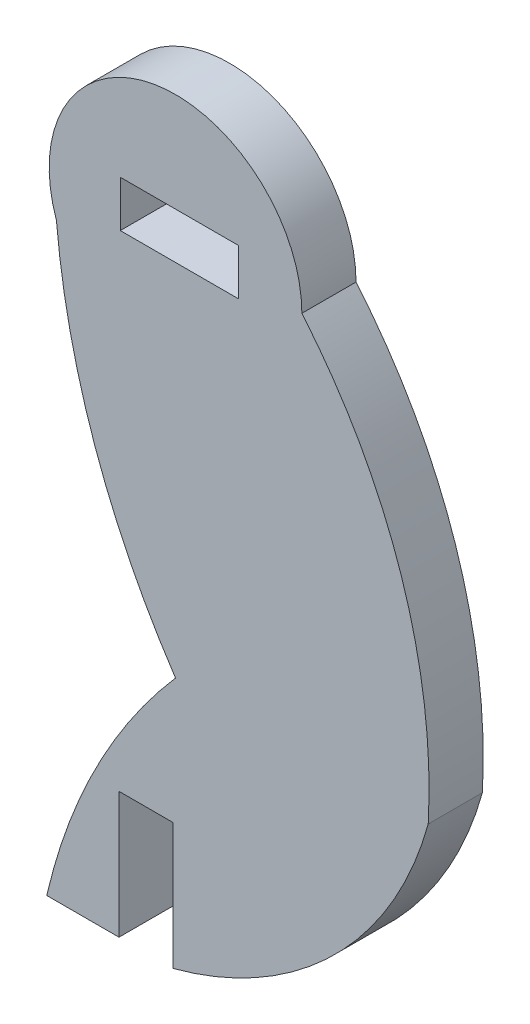
ISO-10303-21;
HEADER;
FILE_DESCRIPTION(('STEP AP214'),'2;1');
FILE_NAME('part.step','',(''),(''),'','','');
FILE_SCHEMA(('AUTOMOTIVE_DESIGN { 1 0 10303 214 1 1 1 1 }'));
ENDSEC;
DATA;
#1=APPLICATION_CONTEXT('core data for automotive mechanical design processes');
#2=APPLICATION_PROTOCOL_DEFINITION('international standard','automotive_design',2000,#1);
#3=PRODUCT_CONTEXT('',#1,'mechanical');
#4=PRODUCT('Part','Part','',(#3));
#5=PRODUCT_RELATED_PRODUCT_CATEGORY('part','',(#4));
#6=PRODUCT_DEFINITION_FORMATION('','',#4);
#7=PRODUCT_DEFINITION_CONTEXT('part definition',#1,'design');
#8=PRODUCT_DEFINITION('design','',#6,#7);
#9=PRODUCT_DEFINITION_SHAPE('','',#8);
#10=(LENGTH_UNIT() NAMED_UNIT(*) SI_UNIT(.MILLI.,.METRE.));
#11=(NAMED_UNIT(*) PLANE_ANGLE_UNIT() SI_UNIT($,.RADIAN.));
#12=(NAMED_UNIT(*) SI_UNIT($,.STERADIAN.) SOLID_ANGLE_UNIT());
#13=UNCERTAINTY_MEASURE_WITH_UNIT(LENGTH_MEASURE(1.E-05),#10,'distance_accuracy_value','');
#14=(GEOMETRIC_REPRESENTATION_CONTEXT(3) GLOBAL_UNCERTAINTY_ASSIGNED_CONTEXT((#13)) GLOBAL_UNIT_ASSIGNED_CONTEXT((#10,
#11,#12)) REPRESENTATION_CONTEXT('',''));
#15=CARTESIAN_POINT('',(0.,0.,0.));
#16=DIRECTION('',(0.,0.,1.));
#17=DIRECTION('',(1.,0.,0.));
#18=AXIS2_PLACEMENT_3D('',#15,#16,#17);
#19=CARTESIAN_POINT('',(33.239340376163,1.25188197338785,3.));
#20=DIRECTION('',(0.,0.,-1.));
#21=DIRECTION('',(-1.,0.,0.));
#22=AXIS2_PLACEMENT_3D('',#19,#20,#21);
#23=CYLINDRICAL_SURFACE('',#22,40.);
#24=CARTESIAN_POINT('',(33.239340376163,1.25188197338785,0.));
#25=DIRECTION('',(0.,0.,1.));
#26=DIRECTION('',(1.,0.,0.));
#27=AXIS2_PLACEMENT_3D('',#24,#25,#26);
#28=CIRCLE('',#27,40.);
#29=CARTESIAN_POINT('',(0.,-21.,0.));
#30=VERTEX_POINT('',#29);
#31=CARTESIAN_POINT('',(-6.59966359422625,-2.33333247589036,0.));
#32=VERTEX_POINT('',#31);
#33=EDGE_CURVE('E211',#30,#32,#28,.F.);
#34=ORIENTED_EDGE('',*,*,#33,.F.);
#35=DIRECTION('',(0.,0.,-1.));
#36=VECTOR('',#35,1.);
#37=CARTESIAN_POINT('',(0.,-21.,3.));
#38=LINE('',#37,#36);
#39=CARTESIAN_POINT('',(0.,-21.,3.));
#40=VERTEX_POINT('',#39);
#41=EDGE_CURVE('E11',#40,#30,#38,.T.);
#42=ORIENTED_EDGE('',*,*,#41,.F.);
#43=CARTESIAN_POINT('',(33.239340376163,1.25188197338785,3.));
#44=DIRECTION('',(0.,0.,1.));
#45=DIRECTION('',(1.,0.,0.));
#46=AXIS2_PLACEMENT_3D('',#43,#44,#45);
#47=CIRCLE('',#46,40.);
#48=CARTESIAN_POINT('',(-6.59966359422625,-2.33333247589036,3.));
#49=VERTEX_POINT('',#48);
#50=EDGE_CURVE('E237',#40,#49,#47,.F.);
#51=ORIENTED_EDGE('',*,*,#50,.T.);
#52=DIRECTION('',(0.,0.,-1.));
#53=VECTOR('',#52,1.);
#54=CARTESIAN_POINT('',(-6.59966359422625,-2.33333247589036,3.));
#55=LINE('',#54,#53);
#56=EDGE_CURVE('E110',#49,#32,#55,.T.);
#57=ORIENTED_EDGE('',*,*,#56,.T.);
#58=EDGE_LOOP('',(#34,#42,#51,#57));
#59=FACE_BOUND('',#58,.T.);
#60=ADVANCED_FACE('F39',(#59),#23,.T.);
#61=CARTESIAN_POINT('',(24.3358214857125,-42.2134191295325,3.));
#62=DIRECTION('',(0.,0.,-1.));
#63=DIRECTION('',(-1.,0.,0.));
#64=AXIS2_PLACEMENT_3D('',#61,#62,#63);
#65=CYLINDRICAL_SURFACE('',#64,32.2837630791344);
#66=CARTESIAN_POINT('',(24.3358214857125,-42.2134191295325,0.));
#67=DIRECTION('',(0.,0.,1.));
#68=DIRECTION('',(1.,0.,0.));
#69=AXIS2_PLACEMENT_3D('',#66,#67,#68);
#70=CIRCLE('',#69,32.2837630791344);
#71=CARTESIAN_POINT('',(-7.13174821725912,-35.,0.));
#72=VERTEX_POINT('',#71);
#73=EDGE_CURVE('E208',#72,#30,#70,.F.);
#74=ORIENTED_EDGE('',*,*,#73,.F.);
#75=DIRECTION('',(0.,0.,-1.));
#76=VECTOR('',#75,1.);
#77=CARTESIAN_POINT('',(-7.13174821725912,-35.,3.));
#78=LINE('',#77,#76);
#79=CARTESIAN_POINT('',(-7.13174821725912,-35.,3.));
#80=VERTEX_POINT('',#79);
#81=EDGE_CURVE('E47',#80,#72,#78,.T.);
#82=ORIENTED_EDGE('',*,*,#81,.F.);
#83=CARTESIAN_POINT('',(24.3358214857125,-42.2134191295325,3.));
#84=DIRECTION('',(0.,0.,1.));
#85=DIRECTION('',(1.,0.,0.));
#86=AXIS2_PLACEMENT_3D('',#83,#84,#85);
#87=CIRCLE('',#86,32.2837630791344);
#88=EDGE_CURVE('E235',#80,#40,#87,.F.);
#89=ORIENTED_EDGE('',*,*,#88,.T.);
#90=ORIENTED_EDGE('',*,*,#41,.T.);
#91=EDGE_LOOP('',(#74,#82,#89,#90));
#92=FACE_BOUND('',#91,.T.);
#93=ADVANCED_FACE('F266',(#92),#65,.T.);
#94=CARTESIAN_POINT('',(0.,-35.,3.));
#95=DIRECTION('',(0.,-1.,0.));
#96=DIRECTION('',(0.,0.,-1.));
#97=AXIS2_PLACEMENT_3D('',#94,#95,#96);
#98=PLANE('',#97);
#99=DIRECTION('',(-1.,0.,0.));
#100=VECTOR('',#99,1.);
#101=CARTESIAN_POINT('',(0.,-35.,0.));
#102=LINE('',#101,#100);
#103=CARTESIAN_POINT('',(-3.1317482172591,-35.,0.));
#104=VERTEX_POINT('',#103);
#105=EDGE_CURVE('E202',#104,#72,#102,.T.);
#106=ORIENTED_EDGE('',*,*,#105,.F.);
#107=DIRECTION('',(0.,0.,-1.));
#108=VECTOR('',#107,1.);
#109=CARTESIAN_POINT('',(-3.1317482172591,-35.,3.));
#110=LINE('',#109,#108);
#111=CARTESIAN_POINT('',(-3.1317482172591,-35.,3.));
#112=VERTEX_POINT('',#111);
#113=EDGE_CURVE('E176',#112,#104,#110,.T.);
#114=ORIENTED_EDGE('',*,*,#113,.F.);
#115=DIRECTION('',(-1.,0.,0.));
#116=VECTOR('',#115,1.);
#117=CARTESIAN_POINT('',(0.,-35.,3.));
#118=LINE('',#117,#116);
#119=EDGE_CURVE('E228',#112,#80,#118,.T.);
#120=ORIENTED_EDGE('',*,*,#119,.T.);
#121=ORIENTED_EDGE('',*,*,#81,.T.);
#122=EDGE_LOOP('',(#106,#114,#120,#121));
#123=FACE_BOUND('',#122,.T.);
#124=ADVANCED_FACE('F271',(#123),#98,.T.);
#125=CARTESIAN_POINT('',(-3.1317482172591,0.,3.));
#126=DIRECTION('',(-1.,0.,0.));
#127=DIRECTION('',(0.,-1.,0.));
#128=AXIS2_PLACEMENT_3D('',#125,#126,#127);
#129=PLANE('',#128);
#130=DIRECTION('',(0.,1.,0.));
#131=VECTOR('',#130,1.);
#132=CARTESIAN_POINT('',(-3.1317482172591,0.,0.));
#133=LINE('',#132,#131);
#134=CARTESIAN_POINT('',(-3.1317482172591,-28.,0.));
#135=VERTEX_POINT('',#134);
#136=EDGE_CURVE('E205',#104,#135,#133,.T.);
#137=ORIENTED_EDGE('',*,*,#136,.T.);
#138=DIRECTION('',(0.,0.,-1.));
#139=VECTOR('',#138,1.);
#140=CARTESIAN_POINT('',(-3.1317482172591,-28.,3.));
#141=LINE('',#140,#139);
#142=CARTESIAN_POINT('',(-3.1317482172591,-28.,3.));
#143=VERTEX_POINT('',#142);
#144=EDGE_CURVE('E173',#143,#135,#141,.T.);
#145=ORIENTED_EDGE('',*,*,#144,.F.);
#146=DIRECTION('',(0.,1.,0.));
#147=VECTOR('',#146,1.);
#148=CARTESIAN_POINT('',(-3.1317482172591,0.,3.));
#149=LINE('',#148,#147);
#150=EDGE_CURVE('E229',#112,#143,#149,.T.);
#151=ORIENTED_EDGE('',*,*,#150,.F.);
#152=ORIENTED_EDGE('',*,*,#113,.T.);
#153=EDGE_LOOP('',(#137,#145,#151,#152));
#154=FACE_BOUND('',#153,.T.);
#155=ADVANCED_FACE('F280',(#154),#129,.F.);
#156=CARTESIAN_POINT('',(0.,-28.,3.));
#157=DIRECTION('',(0.,-1.,0.));
#158=DIRECTION('',(1.,0.,0.));
#159=AXIS2_PLACEMENT_3D('',#156,#157,#158);
#160=PLANE('',#159);
#161=DIRECTION('',(-1.,0.,0.));
#162=VECTOR('',#161,1.);
#163=CARTESIAN_POINT('',(0.,-28.,0.));
#164=LINE('',#163,#162);
#165=CARTESIAN_POINT('',(-0.131748217259136,-28.,0.));
#166=VERTEX_POINT('',#165);
#167=EDGE_CURVE('E200',#166,#135,#164,.T.);
#168=ORIENTED_EDGE('',*,*,#167,.F.);
#169=DIRECTION('',(0.,0.,-1.));
#170=VECTOR('',#169,1.);
#171=CARTESIAN_POINT('',(-0.131748217259136,-28.,3.));
#172=LINE('',#171,#170);
#173=CARTESIAN_POINT('',(-0.131748217259136,-28.,3.));
#174=VERTEX_POINT('',#173);
#175=EDGE_CURVE('E166',#174,#166,#172,.T.);
#176=ORIENTED_EDGE('',*,*,#175,.F.);
#177=DIRECTION('',(-1.,0.,0.));
#178=VECTOR('',#177,1.);
#179=CARTESIAN_POINT('',(0.,-28.,3.));
#180=LINE('',#179,#178);
#181=EDGE_CURVE('E223',#174,#143,#180,.T.);
#182=ORIENTED_EDGE('',*,*,#181,.T.);
#183=ORIENTED_EDGE('',*,*,#144,.T.);
#184=EDGE_LOOP('',(#168,#176,#182,#183));
#185=FACE_BOUND('',#184,.T.);
#186=ADVANCED_FACE('F282',(#185),#160,.T.);
#187=CARTESIAN_POINT('',(-0.131748217259216,0.,3.));
#188=DIRECTION('',(-1.,0.,0.));
#189=DIRECTION('',(0.,-1.,0.));
#190=AXIS2_PLACEMENT_3D('',#187,#188,#189);
#191=PLANE('',#190);
#192=DIRECTION('',(0.,1.,0.));
#193=VECTOR('',#192,1.);
#194=CARTESIAN_POINT('',(-0.131748217259216,0.,0.));
#195=LINE('',#194,#193);
#196=CARTESIAN_POINT('',(-0.131748217259115,-35.,0.));
#197=VERTEX_POINT('',#196);
#198=EDGE_CURVE('E198',#197,#166,#195,.T.);
#199=ORIENTED_EDGE('',*,*,#198,.F.);
#200=DIRECTION('',(0.,0.,-1.));
#201=VECTOR('',#200,1.);
#202=CARTESIAN_POINT('',(-0.131748217259115,-35.,3.));
#203=LINE('',#202,#201);
#204=CARTESIAN_POINT('',(-0.131748217259115,-35.,3.));
#205=VERTEX_POINT('',#204);
#206=EDGE_CURVE('E170',#205,#197,#203,.T.);
#207=ORIENTED_EDGE('',*,*,#206,.F.);
#208=DIRECTION('',(0.,1.,0.));
#209=VECTOR('',#208,1.);
#210=CARTESIAN_POINT('',(-0.131748217259216,0.,3.));
#211=LINE('',#210,#209);
#212=EDGE_CURVE('E161',#205,#174,#211,.T.);
#213=ORIENTED_EDGE('',*,*,#212,.T.);
#214=ORIENTED_EDGE('',*,*,#175,.T.);
#215=EDGE_LOOP('',(#199,#207,#213,#214));
#216=FACE_BOUND('',#215,.T.);
#217=ADVANCED_FACE('F283',(#216),#191,.T.);
#218=CARTESIAN_POINT('',(-5.27762001725334,-15.6733343947275,3.));
#219=DIRECTION('',(0.,0.,-1.));
#220=DIRECTION('',(-1.,0.,0.));
#221=AXIS2_PLACEMENT_3D('',#218,#219,#220);
#222=CYLINDRICAL_SURFACE('',#221,20.);
#223=CARTESIAN_POINT('',(-5.27762001725334,-15.6733343947275,0.));
#224=DIRECTION('',(0.,0.,1.));
#225=DIRECTION('',(1.,0.,0.));
#226=AXIS2_PLACEMENT_3D('',#223,#224,#225);
#227=CIRCLE('',#226,20.);
#228=CARTESIAN_POINT('',(14.,-21.,0.));
#229=VERTEX_POINT('',#228);
#230=EDGE_CURVE('E167',#197,#229,#227,.T.);
#231=ORIENTED_EDGE('',*,*,#230,.T.);
#232=DIRECTION('',(0.,0.,-1.));
#233=VECTOR('',#232,1.);
#234=CARTESIAN_POINT('',(14.,-21.,3.));
#235=LINE('',#234,#233);
#236=CARTESIAN_POINT('',(14.,-21.,3.));
#237=VERTEX_POINT('',#236);
#238=EDGE_CURVE('E151',#237,#229,#235,.T.);
#239=ORIENTED_EDGE('',*,*,#238,.F.);
#240=CARTESIAN_POINT('',(-5.27762001725334,-15.6733343947275,3.));
#241=DIRECTION('',(0.,0.,1.));
#242=DIRECTION('',(1.,0.,0.));
#243=AXIS2_PLACEMENT_3D('',#240,#241,#242);
#244=CIRCLE('',#243,20.);
#245=EDGE_CURVE('E152',#205,#237,#244,.T.);
#246=ORIENTED_EDGE('',*,*,#245,.F.);
#247=ORIENTED_EDGE('',*,*,#206,.T.);
#248=EDGE_LOOP('',(#231,#239,#246,#247));
#249=FACE_BOUND('',#248,.T.);
#250=ADVANCED_FACE('F163',(#249),#222,.T.);
#251=CARTESIAN_POINT('',(-15.9527881328226,-19.3175960442742,3.));
#252=DIRECTION('',(0.,0.,-1.));
#253=DIRECTION('',(-1.,0.,0.));
#254=AXIS2_PLACEMENT_3D('',#251,#252,#253);
#255=CYLINDRICAL_SURFACE('',#254,30.);
#256=CARTESIAN_POINT('',(-15.9527881328226,-19.3175960442742,0.));
#257=DIRECTION('',(0.,0.,1.));
#258=DIRECTION('',(1.,0.,0.));
#259=AXIS2_PLACEMENT_3D('',#256,#257,#258);
#260=CIRCLE('',#259,30.);
#261=CARTESIAN_POINT('',(7.,0.,0.));
#262=VERTEX_POINT('',#261);
#263=EDGE_CURVE('E195',#229,#262,#260,.T.);
#264=ORIENTED_EDGE('',*,*,#263,.T.);
#265=DIRECTION('',(0.,0.,-1.));
#266=VECTOR('',#265,1.);
#267=CARTESIAN_POINT('',(7.,0.,3.));
#268=LINE('',#267,#266);
#269=CARTESIAN_POINT('',(7.,0.,3.));
#270=VERTEX_POINT('',#269);
#271=EDGE_CURVE('E153',#270,#262,#268,.T.);
#272=ORIENTED_EDGE('',*,*,#271,.F.);
#273=CARTESIAN_POINT('',(-15.9527881328226,-19.3175960442742,3.));
#274=DIRECTION('',(0.,0.,1.));
#275=DIRECTION('',(1.,0.,0.));
#276=AXIS2_PLACEMENT_3D('',#273,#274,#275);
#277=CIRCLE('',#276,30.);
#278=EDGE_CURVE('E148',#237,#270,#277,.T.);
#279=ORIENTED_EDGE('',*,*,#278,.F.);
#280=ORIENTED_EDGE('',*,*,#238,.T.);
#281=EDGE_LOOP('',(#264,#272,#279,#280));
#282=FACE_BOUND('',#281,.T.);
#283=ADVANCED_FACE('F149',(#282),#255,.T.);
#284=CARTESIAN_POINT('',(0.,1.5,3.));
#285=DIRECTION('',(0.,1.,0.));
#286=DIRECTION('',(0.,0.,1.));
#287=AXIS2_PLACEMENT_3D('',#284,#285,#286);
#288=PLANE('',#287);
#289=DIRECTION('',(1.,0.,0.));
#290=VECTOR('',#289,1.);
#291=CARTESIAN_POINT('',(0.,1.5,0.));
#292=LINE('',#291,#290);
#293=CARTESIAN_POINT('',(-3.06,1.5,0.));
#294=VERTEX_POINT('',#293);
#295=CARTESIAN_POINT('',(3.5,1.5,0.));
#296=VERTEX_POINT('',#295);
#297=EDGE_CURVE('E222',#294,#296,#292,.T.);
#298=ORIENTED_EDGE('',*,*,#297,.T.);
#299=DIRECTION('',(0.,0.,-1.));
#300=VECTOR('',#299,1.);
#301=CARTESIAN_POINT('',(3.5,1.5,3.));
#302=LINE('',#301,#300);
#303=CARTESIAN_POINT('',(3.5,1.5,3.));
#304=VERTEX_POINT('',#303);
#305=EDGE_CURVE('E43',#304,#296,#302,.T.);
#306=ORIENTED_EDGE('',*,*,#305,.F.);
#307=DIRECTION('',(1.,0.,0.));
#308=VECTOR('',#307,1.);
#309=CARTESIAN_POINT('',(0.,1.5,3.));
#310=LINE('',#309,#308);
#311=CARTESIAN_POINT('',(-3.06,1.5,3.));
#312=VERTEX_POINT('',#311);
#313=EDGE_CURVE('E191',#312,#304,#310,.T.);
#314=ORIENTED_EDGE('',*,*,#313,.F.);
#315=DIRECTION('',(0.,0.,-1.));
#316=VECTOR('',#315,1.);
#317=CARTESIAN_POINT('',(-3.06,1.5,3.));
#318=LINE('',#317,#316);
#319=EDGE_CURVE('E177',#312,#294,#318,.T.);
#320=ORIENTED_EDGE('',*,*,#319,.T.);
#321=EDGE_LOOP('',(#298,#306,#314,#320));
#322=FACE_BOUND('',#321,.T.);
#323=ADVANCED_FACE('F41',(#322),#288,.F.);
#324=CARTESIAN_POINT('',(3.5,0.,3.));
#325=DIRECTION('',(1.,0.,0.));
#326=DIRECTION('',(0.,1.,0.));
#327=AXIS2_PLACEMENT_3D('',#324,#325,#326);
#328=PLANE('',#327);
#329=DIRECTION('',(0.,-1.,0.));
#330=VECTOR('',#329,1.);
#331=CARTESIAN_POINT('',(3.5,0.,0.));
#332=LINE('',#331,#330);
#333=CARTESIAN_POINT('',(3.5,-1.06,0.));
#334=VERTEX_POINT('',#333);
#335=EDGE_CURVE('E218',#296,#334,#332,.T.);
#336=ORIENTED_EDGE('',*,*,#335,.T.);
#337=DIRECTION('',(0.,0.,-1.));
#338=VECTOR('',#337,1.);
#339=CARTESIAN_POINT('',(3.5,-1.06,3.));
#340=LINE('',#339,#338);
#341=CARTESIAN_POINT('',(3.5,-1.06,3.));
#342=VERTEX_POINT('',#341);
#343=EDGE_CURVE('E181',#342,#334,#340,.T.);
#344=ORIENTED_EDGE('',*,*,#343,.F.);
#345=DIRECTION('',(0.,-1.,0.));
#346=VECTOR('',#345,1.);
#347=CARTESIAN_POINT('',(3.5,0.,3.));
#348=LINE('',#347,#346);
#349=EDGE_CURVE('E113',#304,#342,#348,.T.);
#350=ORIENTED_EDGE('',*,*,#349,.F.);
#351=ORIENTED_EDGE('',*,*,#305,.T.);
#352=EDGE_LOOP('',(#336,#344,#350,#351));
#353=FACE_BOUND('',#352,.T.);
#354=ADVANCED_FACE('F260',(#353),#328,.F.);
#355=CARTESIAN_POINT('',(0.,-1.06,3.));
#356=DIRECTION('',(0.,1.,0.));
#357=DIRECTION('',(0.,0.,1.));
#358=AXIS2_PLACEMENT_3D('',#355,#356,#357);
#359=PLANE('',#358);
#360=DIRECTION('',(1.,0.,0.));
#361=VECTOR('',#360,1.);
#362=CARTESIAN_POINT('',(0.,-1.06,0.));
#363=LINE('',#362,#361);
#364=CARTESIAN_POINT('',(-3.06,-1.06,0.));
#365=VERTEX_POINT('',#364);
#366=EDGE_CURVE('E216',#365,#334,#363,.T.);
#367=ORIENTED_EDGE('',*,*,#366,.F.);
#368=DIRECTION('',(0.,0.,-1.));
#369=VECTOR('',#368,1.);
#370=CARTESIAN_POINT('',(-3.06,-1.06,3.));
#371=LINE('',#370,#369);
#372=CARTESIAN_POINT('',(-3.06,-1.06,3.));
#373=VERTEX_POINT('',#372);
#374=EDGE_CURVE('E185',#373,#365,#371,.T.);
#375=ORIENTED_EDGE('',*,*,#374,.F.);
#376=DIRECTION('',(1.,0.,0.));
#377=VECTOR('',#376,1.);
#378=CARTESIAN_POINT('',(0.,-1.06,3.));
#379=LINE('',#378,#377);
#380=EDGE_CURVE('E242',#373,#342,#379,.T.);
#381=ORIENTED_EDGE('',*,*,#380,.T.);
#382=ORIENTED_EDGE('',*,*,#343,.T.);
#383=EDGE_LOOP('',(#367,#375,#381,#382));
#384=FACE_BOUND('',#383,.T.);
#385=ADVANCED_FACE('F254',(#384),#359,.T.);
#386=CARTESIAN_POINT('',(-3.06,0.,3.));
#387=DIRECTION('',(1.,0.,0.));
#388=DIRECTION('',(0.,1.,0.));
#389=AXIS2_PLACEMENT_3D('',#386,#387,#388);
#390=PLANE('',#389);
#391=DIRECTION('',(0.,-1.,0.));
#392=VECTOR('',#391,1.);
#393=CARTESIAN_POINT('',(-3.06,0.,0.));
#394=LINE('',#393,#392);
#395=EDGE_CURVE('E213',#294,#365,#394,.T.);
#396=ORIENTED_EDGE('',*,*,#395,.F.);
#397=ORIENTED_EDGE('',*,*,#319,.F.);
#398=DIRECTION('',(0.,-1.,0.));
#399=VECTOR('',#398,1.);
#400=CARTESIAN_POINT('',(-3.06,0.,3.));
#401=LINE('',#400,#399);
#402=EDGE_CURVE('E236',#312,#373,#401,.T.);
#403=ORIENTED_EDGE('',*,*,#402,.T.);
#404=ORIENTED_EDGE('',*,*,#374,.T.);
#405=EDGE_LOOP('',(#396,#397,#403,#404));
#406=FACE_BOUND('',#405,.T.);
#407=ADVANCED_FACE('F255',(#406),#390,.T.);
#408=CARTESIAN_POINT('',(0.,0.,3.));
#409=DIRECTION('',(0.,0.,-1.));
#410=DIRECTION('',(-1.,0.,0.));
#411=AXIS2_PLACEMENT_3D('',#408,#409,#410);
#412=CYLINDRICAL_SURFACE('',#411,7.);
#413=CARTESIAN_POINT('',(0.,0.,0.));
#414=DIRECTION('',(0.,0.,1.));
#415=DIRECTION('',(1.,0.,0.));
#416=AXIS2_PLACEMENT_3D('',#413,#414,#415);
#417=CIRCLE('',#416,7.);
#418=EDGE_CURVE('E99',#262,#32,#417,.T.);
#419=ORIENTED_EDGE('',*,*,#418,.T.);
#420=ORIENTED_EDGE('',*,*,#56,.F.);
#421=CARTESIAN_POINT('',(0.,0.,3.));
#422=DIRECTION('',(0.,0.,1.));
#423=DIRECTION('',(1.,0.,0.));
#424=AXIS2_PLACEMENT_3D('',#421,#422,#423);
#425=CIRCLE('',#424,7.);
#426=EDGE_CURVE('E59',#270,#49,#425,.T.);
#427=ORIENTED_EDGE('',*,*,#426,.F.);
#428=ORIENTED_EDGE('',*,*,#271,.T.);
#429=EDGE_LOOP('',(#419,#420,#427,#428));
#430=FACE_BOUND('',#429,.T.);
#431=ADVANCED_FACE('F263',(#430),#412,.T.);
#432=CARTESIAN_POINT('',(0.,0.,3.));
#433=DIRECTION('',(0.,0.,1.));
#434=DIRECTION('',(1.,0.,0.));
#435=AXIS2_PLACEMENT_3D('',#432,#433,#434);
#436=PLANE('',#435);
#437=ORIENTED_EDGE('',*,*,#313,.T.);
#438=ORIENTED_EDGE('',*,*,#349,.T.);
#439=ORIENTED_EDGE('',*,*,#380,.F.);
#440=ORIENTED_EDGE('',*,*,#402,.F.);
#441=EDGE_LOOP('',(#437,#438,#439,#440));
#442=FACE_BOUND('',#441,.T.);
#443=ORIENTED_EDGE('',*,*,#50,.F.);
#444=ORIENTED_EDGE('',*,*,#88,.F.);
#445=ORIENTED_EDGE('',*,*,#119,.F.);
#446=ORIENTED_EDGE('',*,*,#150,.T.);
#447=ORIENTED_EDGE('',*,*,#181,.F.);
#448=ORIENTED_EDGE('',*,*,#212,.F.);
#449=ORIENTED_EDGE('',*,*,#245,.T.);
#450=ORIENTED_EDGE('',*,*,#278,.T.);
#451=ORIENTED_EDGE('',*,*,#426,.T.);
#452=EDGE_LOOP('',(#443,#444,#445,#446,#447,#448,#449,#450,#451));
#453=FACE_BOUND('',#452,.T.);
#454=ADVANCED_FACE('F158',(#442,#453),#436,.T.);
#455=CARTESIAN_POINT('',(0.,0.,0.));
#456=DIRECTION('',(0.,0.,1.));
#457=DIRECTION('',(1.,0.,0.));
#458=AXIS2_PLACEMENT_3D('',#455,#456,#457);
#459=PLANE('',#458);
#460=ORIENTED_EDGE('',*,*,#297,.F.);
#461=ORIENTED_EDGE('',*,*,#395,.T.);
#462=ORIENTED_EDGE('',*,*,#366,.T.);
#463=ORIENTED_EDGE('',*,*,#335,.F.);
#464=EDGE_LOOP('',(#460,#461,#462,#463));
#465=FACE_BOUND('',#464,.T.);
#466=ORIENTED_EDGE('',*,*,#33,.T.);
#467=ORIENTED_EDGE('',*,*,#418,.F.);
#468=ORIENTED_EDGE('',*,*,#263,.F.);
#469=ORIENTED_EDGE('',*,*,#230,.F.);
#470=ORIENTED_EDGE('',*,*,#198,.T.);
#471=ORIENTED_EDGE('',*,*,#167,.T.);
#472=ORIENTED_EDGE('',*,*,#136,.F.);
#473=ORIENTED_EDGE('',*,*,#105,.T.);
#474=ORIENTED_EDGE('',*,*,#73,.T.);
#475=EDGE_LOOP('',(#466,#467,#468,#469,#470,#471,#472,#473,#474));
#476=FACE_BOUND('',#475,.T.);
#477=ADVANCED_FACE('F252',(#465,#476),#459,.F.);
#478=CLOSED_SHELL('',(#60,#93,#124,#155,#186,#217,#250,#283,#323,#354,#385,#407,#431,#454,#477));
#479=MANIFOLD_SOLID_BREP('B2',#478);
#480=ADVANCED_BREP_SHAPE_REPRESENTATION('',(#18,#479),#14);
#481=SHAPE_DEFINITION_REPRESENTATION(#9,#480);
ENDSEC;
END-ISO-10303-21;
